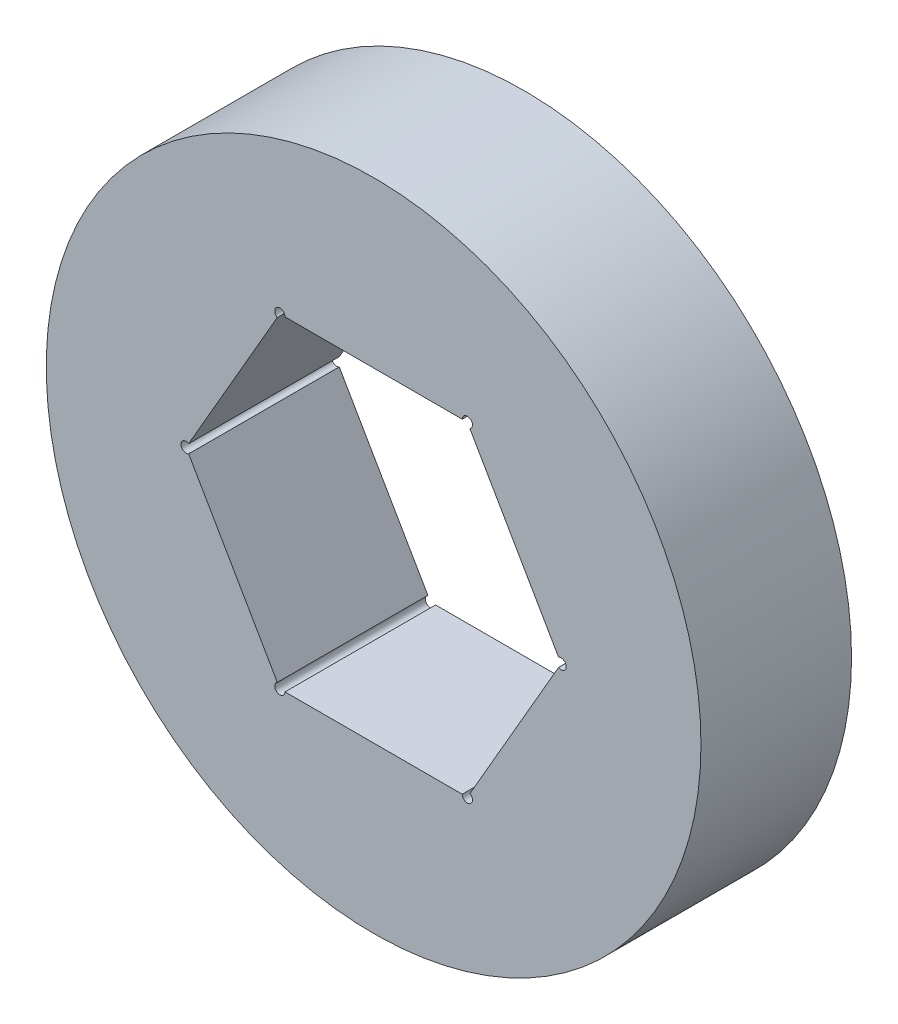
ISO-10303-21;
HEADER;
FILE_DESCRIPTION(('STEP AP214'),'2;1');
FILE_NAME('part.step','',(''),(''),'','','');
FILE_SCHEMA(('AUTOMOTIVE_DESIGN { 1 0 10303 214 1 1 1 1 }'));
ENDSEC;
DATA;
#1=APPLICATION_CONTEXT('core data for automotive mechanical design processes');
#2=APPLICATION_PROTOCOL_DEFINITION('international standard','automotive_design',2000,#1);
#3=PRODUCT_CONTEXT('',#1,'mechanical');
#4=PRODUCT('Part','Part','',(#3));
#5=PRODUCT_RELATED_PRODUCT_CATEGORY('part','',(#4));
#6=PRODUCT_DEFINITION_FORMATION('','',#4);
#7=PRODUCT_DEFINITION_CONTEXT('part definition',#1,'design');
#8=PRODUCT_DEFINITION('design','',#6,#7);
#9=PRODUCT_DEFINITION_SHAPE('','',#8);
#10=(LENGTH_UNIT() NAMED_UNIT(*) SI_UNIT(.MILLI.,.METRE.));
#11=(NAMED_UNIT(*) PLANE_ANGLE_UNIT() SI_UNIT($,.RADIAN.));
#12=(NAMED_UNIT(*) SI_UNIT($,.STERADIAN.) SOLID_ANGLE_UNIT());
#13=UNCERTAINTY_MEASURE_WITH_UNIT(LENGTH_MEASURE(1.E-05),#10,'distance_accuracy_value','');
#14=(GEOMETRIC_REPRESENTATION_CONTEXT(3) GLOBAL_UNCERTAINTY_ASSIGNED_CONTEXT((#13)) GLOBAL_UNIT_ASSIGNED_CONTEXT((#10,
#11,#12)) REPRESENTATION_CONTEXT('',''));
#15=CARTESIAN_POINT('',(0.,0.,0.));
#16=DIRECTION('',(0.,0.,1.));
#17=DIRECTION('',(1.,0.,0.));
#18=AXIS2_PLACEMENT_3D('',#15,#16,#17);
#19=CARTESIAN_POINT('',(0.,0.,5.842));
#20=DIRECTION('',(0.,0.,1.));
#21=DIRECTION('',(1.,0.,0.));
#22=AXIS2_PLACEMENT_3D('',#19,#20,#21);
#23=PLANE('',#22);
#24=CARTESIAN_POINT('',(7.27461339178928,0.,5.842));
#25=DIRECTION('',(0.,0.,1.));
#26=DIRECTION('',(1.,0.,0.));
#27=AXIS2_PLACEMENT_3D('',#24,#25,#26);
#28=CIRCLE('',#27,0.1984375);
#29=CARTESIAN_POINT('',(7.17539464178928,-0.171851916063474,5.842));
#30=VERTEX_POINT('',#29);
#31=CARTESIAN_POINT('',(7.17539464178928,0.171851916063475,5.842));
#32=VERTEX_POINT('',#31);
#33=EDGE_CURVE('E49',#30,#32,#28,.T.);
#34=ORIENTED_EDGE('',*,*,#33,.F.);
#35=DIRECTION('',(0.5,0.866025403784439,0.));
#36=VECTOR('',#35,1.);
#37=CARTESIAN_POINT('',(3.63730669589464,-6.3,5.842));
#38=LINE('',#37,#36);
#39=CARTESIAN_POINT('',(3.73652544589464,-6.12814808393653,5.842));
#40=VERTEX_POINT('',#39);
#41=EDGE_CURVE('E134',#40,#30,#38,.T.);
#42=ORIENTED_EDGE('',*,*,#41,.F.);
#43=CARTESIAN_POINT('',(3.63730669589464,-6.3,5.842));
#44=DIRECTION('',(0.,0.,1.));
#45=DIRECTION('',(1.,0.,0.));
#46=AXIS2_PLACEMENT_3D('',#43,#44,#45);
#47=CIRCLE('',#46,0.1984375);
#48=CARTESIAN_POINT('',(3.43886919589464,-6.3,5.842));
#49=VERTEX_POINT('',#48);
#50=EDGE_CURVE('E57',#49,#40,#47,.T.);
#51=ORIENTED_EDGE('',*,*,#50,.F.);
#52=DIRECTION('',(1.,0.,0.));
#53=VECTOR('',#52,1.);
#54=CARTESIAN_POINT('',(-3.63730669589464,-6.3,5.842));
#55=LINE('',#54,#53);
#56=CARTESIAN_POINT('',(-3.43886919589464,-6.3,5.842));
#57=VERTEX_POINT('',#56);
#58=EDGE_CURVE('E139',#57,#49,#55,.T.);
#59=ORIENTED_EDGE('',*,*,#58,.F.);
#60=CARTESIAN_POINT('',(-3.63730669589464,-6.3,5.842));
#61=DIRECTION('',(0.,0.,1.));
#62=DIRECTION('',(1.,0.,0.));
#63=AXIS2_PLACEMENT_3D('',#60,#61,#62);
#64=CIRCLE('',#63,0.1984375);
#65=CARTESIAN_POINT('',(-3.73652544589464,-6.12814808393653,5.842));
#66=VERTEX_POINT('',#65);
#67=EDGE_CURVE('E191',#66,#57,#64,.T.);
#68=ORIENTED_EDGE('',*,*,#67,.F.);
#69=DIRECTION('',(0.5,-0.866025403784439,0.));
#70=VECTOR('',#69,1.);
#71=CARTESIAN_POINT('',(-7.27461339178929,0.,5.842));
#72=LINE('',#71,#70);
#73=CARTESIAN_POINT('',(-7.17539464178928,-0.171851916063477,5.842));
#74=VERTEX_POINT('',#73);
#75=EDGE_CURVE('E144',#74,#66,#72,.T.);
#76=ORIENTED_EDGE('',*,*,#75,.F.);
#77=CARTESIAN_POINT('',(-7.27461339178929,0.,5.842));
#78=DIRECTION('',(0.,0.,1.));
#79=DIRECTION('',(1.,0.,0.));
#80=AXIS2_PLACEMENT_3D('',#77,#78,#79);
#81=CIRCLE('',#80,0.1984375);
#82=CARTESIAN_POINT('',(-7.17539464178929,0.171851916063472,5.842));
#83=VERTEX_POINT('',#82);
#84=EDGE_CURVE('E200',#83,#74,#81,.T.);
#85=ORIENTED_EDGE('',*,*,#84,.F.);
#86=DIRECTION('',(-0.5,-0.866025403784439,0.));
#87=VECTOR('',#86,1.);
#88=CARTESIAN_POINT('',(-3.63730669589464,6.3,5.842));
#89=LINE('',#88,#87);
#90=CARTESIAN_POINT('',(-3.73652544589464,6.12814808393653,5.842));
#91=VERTEX_POINT('',#90);
#92=EDGE_CURVE('E168',#91,#83,#89,.T.);
#93=ORIENTED_EDGE('',*,*,#92,.F.);
#94=CARTESIAN_POINT('',(-3.63730669589464,6.3,5.842));
#95=DIRECTION('',(0.,0.,1.));
#96=DIRECTION('',(1.,0.,0.));
#97=AXIS2_PLACEMENT_3D('',#94,#95,#96);
#98=CIRCLE('',#97,0.1984375);
#99=CARTESIAN_POINT('',(-3.43886919589464,6.3,5.842));
#100=VERTEX_POINT('',#99);
#101=EDGE_CURVE('E207',#100,#91,#98,.T.);
#102=ORIENTED_EDGE('',*,*,#101,.F.);
#103=DIRECTION('',(-1.,0.,0.));
#104=VECTOR('',#103,1.);
#105=CARTESIAN_POINT('',(3.63730669589464,6.3,5.842));
#106=LINE('',#105,#104);
#107=CARTESIAN_POINT('',(3.43886919589464,6.3,5.842));
#108=VERTEX_POINT('',#107);
#109=EDGE_CURVE('E141',#108,#100,#106,.T.);
#110=ORIENTED_EDGE('',*,*,#109,.F.);
#111=CARTESIAN_POINT('',(3.63730669589464,6.3,5.842));
#112=DIRECTION('',(0.,0.,1.));
#113=DIRECTION('',(1.,0.,0.));
#114=AXIS2_PLACEMENT_3D('',#111,#112,#113);
#115=CIRCLE('',#114,0.1984375);
#116=CARTESIAN_POINT('',(3.73652544589464,6.12814808393653,5.842));
#117=VERTEX_POINT('',#116);
#118=EDGE_CURVE('E214',#117,#108,#115,.T.);
#119=ORIENTED_EDGE('',*,*,#118,.F.);
#120=DIRECTION('',(-0.5,0.866025403784439,0.));
#121=VECTOR('',#120,1.);
#122=CARTESIAN_POINT('',(7.27461339178928,0.,5.842));
#123=LINE('',#122,#121);
#124=EDGE_CURVE('E136',#32,#117,#123,.T.);
#125=ORIENTED_EDGE('',*,*,#124,.F.);
#126=EDGE_LOOP('',(#34,#42,#51,#59,#68,#76,#85,#93,#102,#110,#119,#125));
#127=FACE_BOUND('',#126,.T.);
#128=CARTESIAN_POINT('',(0.,0.,5.842));
#129=DIRECTION('',(0.,0.,1.));
#130=DIRECTION('',(1.,0.,0.));
#131=AXIS2_PLACEMENT_3D('',#128,#129,#130);
#132=CIRCLE('',#131,12.7);
#133=CARTESIAN_POINT('',(12.7,0.,5.842));
#134=VERTEX_POINT('',#133);
#135=EDGE_CURVE('E169',#134,#134,#132,.T.);
#136=ORIENTED_EDGE('',*,*,#135,.T.);
#137=EDGE_LOOP('',(#136));
#138=FACE_BOUND('',#137,.T.);
#139=ADVANCED_FACE('F35',(#127,#138),#23,.T.);
#140=CARTESIAN_POINT('',(0.,0.,0.));
#141=DIRECTION('',(0.,0.,1.));
#142=DIRECTION('',(1.,0.,0.));
#143=AXIS2_PLACEMENT_3D('',#140,#141,#142);
#144=PLANE('',#143);
#145=CARTESIAN_POINT('',(0.,0.,0.));
#146=DIRECTION('',(0.,0.,1.));
#147=DIRECTION('',(1.,0.,0.));
#148=AXIS2_PLACEMENT_3D('',#145,#146,#147);
#149=CIRCLE('',#148,12.7);
#150=CARTESIAN_POINT('',(12.7,0.,0.));
#151=VERTEX_POINT('',#150);
#152=EDGE_CURVE('E150',#151,#151,#149,.T.);
#153=ORIENTED_EDGE('',*,*,#152,.F.);
#154=EDGE_LOOP('',(#153));
#155=FACE_BOUND('',#154,.T.);
#156=DIRECTION('',(0.5,0.866025403784439,0.));
#157=VECTOR('',#156,1.);
#158=CARTESIAN_POINT('',(3.63730669589464,-6.3,0.));
#159=LINE('',#158,#157);
#160=CARTESIAN_POINT('',(3.73652544589464,-6.12814808393653,0.));
#161=VERTEX_POINT('',#160);
#162=CARTESIAN_POINT('',(7.17539464178928,-0.171851916063474,0.));
#163=VERTEX_POINT('',#162);
#164=EDGE_CURVE('E161',#161,#163,#159,.T.);
#165=ORIENTED_EDGE('',*,*,#164,.T.);
#166=CARTESIAN_POINT('',(7.27461339178928,0.,0.));
#167=DIRECTION('',(0.,0.,1.));
#168=DIRECTION('',(1.,0.,0.));
#169=AXIS2_PLACEMENT_3D('',#166,#167,#168);
#170=CIRCLE('',#169,0.1984375);
#171=CARTESIAN_POINT('',(7.17539464178928,0.171851916063475,0.));
#172=VERTEX_POINT('',#171);
#173=EDGE_CURVE('E124',#163,#172,#170,.T.);
#174=ORIENTED_EDGE('',*,*,#173,.T.);
#175=DIRECTION('',(-0.5,0.866025403784439,0.));
#176=VECTOR('',#175,1.);
#177=CARTESIAN_POINT('',(7.27461339178928,0.,0.));
#178=LINE('',#177,#176);
#179=CARTESIAN_POINT('',(3.73652544589464,6.12814808393653,0.));
#180=VERTEX_POINT('',#179);
#181=EDGE_CURVE('E163',#172,#180,#178,.T.);
#182=ORIENTED_EDGE('',*,*,#181,.T.);
#183=CARTESIAN_POINT('',(3.63730669589464,6.3,0.));
#184=DIRECTION('',(0.,0.,1.));
#185=DIRECTION('',(1.,0.,0.));
#186=AXIS2_PLACEMENT_3D('',#183,#184,#185);
#187=CIRCLE('',#186,0.1984375);
#188=CARTESIAN_POINT('',(3.43886919589464,6.3,0.));
#189=VERTEX_POINT('',#188);
#190=EDGE_CURVE('E215',#180,#189,#187,.T.);
#191=ORIENTED_EDGE('',*,*,#190,.T.);
#192=DIRECTION('',(-1.,0.,0.));
#193=VECTOR('',#192,1.);
#194=CARTESIAN_POINT('',(3.63730669589464,6.3,0.));
#195=LINE('',#194,#193);
#196=CARTESIAN_POINT('',(-3.43886919589464,6.3,0.));
#197=VERTEX_POINT('',#196);
#198=EDGE_CURVE('E165',#189,#197,#195,.T.);
#199=ORIENTED_EDGE('',*,*,#198,.T.);
#200=CARTESIAN_POINT('',(-3.63730669589464,6.3,0.));
#201=DIRECTION('',(0.,0.,1.));
#202=DIRECTION('',(1.,0.,0.));
#203=AXIS2_PLACEMENT_3D('',#200,#201,#202);
#204=CIRCLE('',#203,0.1984375);
#205=CARTESIAN_POINT('',(-3.73652544589464,6.12814808393653,0.));
#206=VERTEX_POINT('',#205);
#207=EDGE_CURVE('E208',#197,#206,#204,.T.);
#208=ORIENTED_EDGE('',*,*,#207,.T.);
#209=DIRECTION('',(-0.5,-0.866025403784439,0.));
#210=VECTOR('',#209,1.);
#211=CARTESIAN_POINT('',(-3.63730669589464,6.3,0.));
#212=LINE('',#211,#210);
#213=CARTESIAN_POINT('',(-7.17539464178929,0.171851916063472,0.));
#214=VERTEX_POINT('',#213);
#215=EDGE_CURVE('E151',#206,#214,#212,.T.);
#216=ORIENTED_EDGE('',*,*,#215,.T.);
#217=CARTESIAN_POINT('',(-7.27461339178929,0.,0.));
#218=DIRECTION('',(0.,0.,1.));
#219=DIRECTION('',(1.,0.,0.));
#220=AXIS2_PLACEMENT_3D('',#217,#218,#219);
#221=CIRCLE('',#220,0.1984375);
#222=CARTESIAN_POINT('',(-7.17539464178928,-0.171851916063477,0.));
#223=VERTEX_POINT('',#222);
#224=EDGE_CURVE('E201',#214,#223,#221,.T.);
#225=ORIENTED_EDGE('',*,*,#224,.T.);
#226=DIRECTION('',(0.5,-0.866025403784439,0.));
#227=VECTOR('',#226,1.);
#228=CARTESIAN_POINT('',(-7.27461339178929,0.,0.));
#229=LINE('',#228,#227);
#230=CARTESIAN_POINT('',(-3.73652544589464,-6.12814808393653,0.));
#231=VERTEX_POINT('',#230);
#232=EDGE_CURVE('E154',#223,#231,#229,.T.);
#233=ORIENTED_EDGE('',*,*,#232,.T.);
#234=CARTESIAN_POINT('',(-3.63730669589464,-6.3,0.));
#235=DIRECTION('',(0.,0.,1.));
#236=DIRECTION('',(1.,0.,0.));
#237=AXIS2_PLACEMENT_3D('',#234,#235,#236);
#238=CIRCLE('',#237,0.1984375);
#239=CARTESIAN_POINT('',(-3.43886919589464,-6.3,0.));
#240=VERTEX_POINT('',#239);
#241=EDGE_CURVE('E195',#231,#240,#238,.T.);
#242=ORIENTED_EDGE('',*,*,#241,.T.);
#243=DIRECTION('',(1.,0.,0.));
#244=VECTOR('',#243,1.);
#245=CARTESIAN_POINT('',(-3.63730669589464,-6.3,0.));
#246=LINE('',#245,#244);
#247=CARTESIAN_POINT('',(3.43886919589464,-6.3,0.));
#248=VERTEX_POINT('',#247);
#249=EDGE_CURVE('E158',#240,#248,#246,.T.);
#250=ORIENTED_EDGE('',*,*,#249,.T.);
#251=CARTESIAN_POINT('',(3.63730669589464,-6.3,0.));
#252=DIRECTION('',(0.,0.,1.));
#253=DIRECTION('',(1.,0.,0.));
#254=AXIS2_PLACEMENT_3D('',#251,#252,#253);
#255=CIRCLE('',#254,0.1984375);
#256=EDGE_CURVE('E183',#248,#161,#255,.T.);
#257=ORIENTED_EDGE('',*,*,#256,.T.);
#258=EDGE_LOOP('',(#165,#174,#182,#191,#199,#208,#216,#225,#233,#242,#250,#257));
#259=FACE_BOUND('',#258,.T.);
#260=ADVANCED_FACE('F186',(#155,#259),#144,.F.);
#261=CARTESIAN_POINT('',(0.,0.,5.842));
#262=DIRECTION('',(0.,0.,-1.));
#263=DIRECTION('',(-1.,0.,0.));
#264=AXIS2_PLACEMENT_3D('',#261,#262,#263);
#265=CYLINDRICAL_SURFACE('',#264,12.7);
#266=ORIENTED_EDGE('',*,*,#135,.F.);
#267=EDGE_LOOP('',(#266));
#268=FACE_BOUND('',#267,.T.);
#269=ORIENTED_EDGE('',*,*,#152,.T.);
#270=EDGE_LOOP('',(#269));
#271=FACE_BOUND('',#270,.T.);
#272=ADVANCED_FACE('F37',(#268,#271),#265,.T.);
#273=CARTESIAN_POINT('',(-3.63730669589464,6.3,5.842));
#274=DIRECTION('',(0.866025403784439,-0.5,0.));
#275=DIRECTION('',(0.5,0.866025403784439,0.));
#276=AXIS2_PLACEMENT_3D('',#273,#274,#275);
#277=PLANE('',#276);
#278=DIRECTION('',(0.,0.,1.));
#279=VECTOR('',#278,1.);
#280=CARTESIAN_POINT('',(-7.17539464178929,0.171851916063472,0.));
#281=LINE('',#280,#279);
#282=EDGE_CURVE('E204',#214,#83,#281,.T.);
#283=ORIENTED_EDGE('',*,*,#282,.F.);
#284=ORIENTED_EDGE('',*,*,#215,.F.);
#285=DIRECTION('',(0.,0.,1.));
#286=VECTOR('',#285,1.);
#287=CARTESIAN_POINT('',(-3.73652544589464,6.12814808393653,0.));
#288=LINE('',#287,#286);
#289=EDGE_CURVE('E211',#91,#206,#288,.F.);
#290=ORIENTED_EDGE('',*,*,#289,.F.);
#291=ORIENTED_EDGE('',*,*,#92,.T.);
#292=EDGE_LOOP('',(#283,#284,#290,#291));
#293=FACE_BOUND('',#292,.T.);
#294=ADVANCED_FACE('F246',(#293),#277,.T.);
#295=CARTESIAN_POINT('',(-7.27461339178929,0.,5.842));
#296=DIRECTION('',(0.866025403784439,0.5,0.));
#297=DIRECTION('',(-0.5,0.866025403784439,0.));
#298=AXIS2_PLACEMENT_3D('',#295,#296,#297);
#299=PLANE('',#298);
#300=DIRECTION('',(0.,0.,1.));
#301=VECTOR('',#300,1.);
#302=CARTESIAN_POINT('',(-3.73652544589464,-6.12814808393653,0.));
#303=LINE('',#302,#301);
#304=EDGE_CURVE('E197',#231,#66,#303,.T.);
#305=ORIENTED_EDGE('',*,*,#304,.F.);
#306=ORIENTED_EDGE('',*,*,#232,.F.);
#307=DIRECTION('',(0.,0.,1.));
#308=VECTOR('',#307,1.);
#309=CARTESIAN_POINT('',(-7.17539464178928,-0.171851916063477,0.));
#310=LINE('',#309,#308);
#311=EDGE_CURVE('E178',#74,#223,#310,.F.);
#312=ORIENTED_EDGE('',*,*,#311,.F.);
#313=ORIENTED_EDGE('',*,*,#75,.T.);
#314=EDGE_LOOP('',(#305,#306,#312,#313));
#315=FACE_BOUND('',#314,.T.);
#316=ADVANCED_FACE('F227',(#315),#299,.T.);
#317=CARTESIAN_POINT('',(-3.63730669589464,-6.3,5.842));
#318=DIRECTION('',(0.,1.,0.));
#319=DIRECTION('',(0.,0.,1.));
#320=AXIS2_PLACEMENT_3D('',#317,#318,#319);
#321=PLANE('',#320);
#322=DIRECTION('',(0.,0.,1.));
#323=VECTOR('',#322,1.);
#324=CARTESIAN_POINT('',(3.43886919589464,-6.3,0.));
#325=LINE('',#324,#323);
#326=EDGE_CURVE('E189',#248,#49,#325,.T.);
#327=ORIENTED_EDGE('',*,*,#326,.F.);
#328=ORIENTED_EDGE('',*,*,#249,.F.);
#329=DIRECTION('',(0.,0.,1.));
#330=VECTOR('',#329,1.);
#331=CARTESIAN_POINT('',(-3.43886919589464,-6.3,0.));
#332=LINE('',#331,#330);
#333=EDGE_CURVE('E180',#57,#240,#332,.F.);
#334=ORIENTED_EDGE('',*,*,#333,.F.);
#335=ORIENTED_EDGE('',*,*,#58,.T.);
#336=EDGE_LOOP('',(#327,#328,#334,#335));
#337=FACE_BOUND('',#336,.T.);
#338=ADVANCED_FACE('F237',(#337),#321,.T.);
#339=CARTESIAN_POINT('',(3.63730669589464,-6.3,5.842));
#340=DIRECTION('',(-0.866025403784439,0.5,0.));
#341=DIRECTION('',(-0.5,-0.866025403784439,0.));
#342=AXIS2_PLACEMENT_3D('',#339,#340,#341);
#343=PLANE('',#342);
#344=DIRECTION('',(0.,0.,1.));
#345=VECTOR('',#344,1.);
#346=CARTESIAN_POINT('',(7.17539464178928,-0.171851916063474,0.));
#347=LINE('',#346,#345);
#348=EDGE_CURVE('E121',#163,#30,#347,.T.);
#349=ORIENTED_EDGE('',*,*,#348,.F.);
#350=ORIENTED_EDGE('',*,*,#164,.F.);
#351=DIRECTION('',(0.,0.,1.));
#352=VECTOR('',#351,1.);
#353=CARTESIAN_POINT('',(3.73652544589464,-6.12814808393653,0.));
#354=LINE('',#353,#352);
#355=EDGE_CURVE('E43',#40,#161,#354,.F.);
#356=ORIENTED_EDGE('',*,*,#355,.F.);
#357=ORIENTED_EDGE('',*,*,#41,.T.);
#358=EDGE_LOOP('',(#349,#350,#356,#357));
#359=FACE_BOUND('',#358,.T.);
#360=ADVANCED_FACE('F138',(#359),#343,.T.);
#361=CARTESIAN_POINT('',(7.27461339178928,0.,5.842));
#362=DIRECTION('',(-0.866025403784439,-0.5,0.));
#363=DIRECTION('',(0.5,-0.866025403784439,0.));
#364=AXIS2_PLACEMENT_3D('',#361,#362,#363);
#365=PLANE('',#364);
#366=DIRECTION('',(0.,0.,1.));
#367=VECTOR('',#366,1.);
#368=CARTESIAN_POINT('',(7.17539464178928,0.171851916063475,0.));
#369=LINE('',#368,#367);
#370=EDGE_CURVE('E11',#32,#172,#369,.F.);
#371=ORIENTED_EDGE('',*,*,#370,.F.);
#372=ORIENTED_EDGE('',*,*,#124,.T.);
#373=DIRECTION('',(0.,0.,1.));
#374=VECTOR('',#373,1.);
#375=CARTESIAN_POINT('',(3.73652544589464,6.12814808393653,0.));
#376=LINE('',#375,#374);
#377=EDGE_CURVE('E155',#180,#117,#376,.T.);
#378=ORIENTED_EDGE('',*,*,#377,.F.);
#379=ORIENTED_EDGE('',*,*,#181,.F.);
#380=EDGE_LOOP('',(#371,#372,#378,#379));
#381=FACE_BOUND('',#380,.T.);
#382=ADVANCED_FACE('F244',(#381),#365,.T.);
#383=CARTESIAN_POINT('',(3.63730669589464,6.3,5.842));
#384=DIRECTION('',(0.,-1.,0.));
#385=DIRECTION('',(1.,0.,0.));
#386=AXIS2_PLACEMENT_3D('',#383,#384,#385);
#387=PLANE('',#386);
#388=DIRECTION('',(0.,0.,1.));
#389=VECTOR('',#388,1.);
#390=CARTESIAN_POINT('',(-3.43886919589464,6.3,0.));
#391=LINE('',#390,#389);
#392=EDGE_CURVE('E176',#197,#100,#391,.T.);
#393=ORIENTED_EDGE('',*,*,#392,.F.);
#394=ORIENTED_EDGE('',*,*,#198,.F.);
#395=DIRECTION('',(0.,0.,1.));
#396=VECTOR('',#395,1.);
#397=CARTESIAN_POINT('',(3.43886919589464,6.3,0.));
#398=LINE('',#397,#396);
#399=EDGE_CURVE('E172',#108,#189,#398,.F.);
#400=ORIENTED_EDGE('',*,*,#399,.F.);
#401=ORIENTED_EDGE('',*,*,#109,.T.);
#402=EDGE_LOOP('',(#393,#394,#400,#401));
#403=FACE_BOUND('',#402,.T.);
#404=ADVANCED_FACE('F271',(#403),#387,.T.);
#405=CARTESIAN_POINT('',(3.63730669589464,6.3,0.));
#406=DIRECTION('',(0.,0.,1.));
#407=DIRECTION('',(1.,0.,0.));
#408=AXIS2_PLACEMENT_3D('',#405,#406,#407);
#409=CYLINDRICAL_SURFACE('',#408,0.1984375);
#410=ORIENTED_EDGE('',*,*,#377,.T.);
#411=ORIENTED_EDGE('',*,*,#118,.T.);
#412=ORIENTED_EDGE('',*,*,#399,.T.);
#413=ORIENTED_EDGE('',*,*,#190,.F.);
#414=EDGE_LOOP('',(#410,#411,#412,#413));
#415=FACE_BOUND('',#414,.T.);
#416=ADVANCED_FACE('F275',(#415),#409,.F.);
#417=CARTESIAN_POINT('',(-3.63730669589464,6.3,0.));
#418=DIRECTION('',(0.,0.,1.));
#419=DIRECTION('',(1.,0.,0.));
#420=AXIS2_PLACEMENT_3D('',#417,#418,#419);
#421=CYLINDRICAL_SURFACE('',#420,0.1984375);
#422=ORIENTED_EDGE('',*,*,#289,.T.);
#423=ORIENTED_EDGE('',*,*,#207,.F.);
#424=ORIENTED_EDGE('',*,*,#392,.T.);
#425=ORIENTED_EDGE('',*,*,#101,.T.);
#426=EDGE_LOOP('',(#422,#423,#424,#425));
#427=FACE_BOUND('',#426,.T.);
#428=ADVANCED_FACE('F268',(#427),#421,.F.);
#429=CARTESIAN_POINT('',(-7.27461339178929,0.,0.));
#430=DIRECTION('',(0.,0.,1.));
#431=DIRECTION('',(1.,0.,0.));
#432=AXIS2_PLACEMENT_3D('',#429,#430,#431);
#433=CYLINDRICAL_SURFACE('',#432,0.1984375);
#434=ORIENTED_EDGE('',*,*,#282,.T.);
#435=ORIENTED_EDGE('',*,*,#84,.T.);
#436=ORIENTED_EDGE('',*,*,#311,.T.);
#437=ORIENTED_EDGE('',*,*,#224,.F.);
#438=EDGE_LOOP('',(#434,#435,#436,#437));
#439=FACE_BOUND('',#438,.T.);
#440=ADVANCED_FACE('F292',(#439),#433,.F.);
#441=CARTESIAN_POINT('',(-3.63730669589464,-6.3,0.));
#442=DIRECTION('',(0.,0.,1.));
#443=DIRECTION('',(1.,0.,0.));
#444=AXIS2_PLACEMENT_3D('',#441,#442,#443);
#445=CYLINDRICAL_SURFACE('',#444,0.1984375);
#446=ORIENTED_EDGE('',*,*,#304,.T.);
#447=ORIENTED_EDGE('',*,*,#67,.T.);
#448=ORIENTED_EDGE('',*,*,#333,.T.);
#449=ORIENTED_EDGE('',*,*,#241,.F.);
#450=EDGE_LOOP('',(#446,#447,#448,#449));
#451=FACE_BOUND('',#450,.T.);
#452=ADVANCED_FACE('F235',(#451),#445,.F.);
#453=CARTESIAN_POINT('',(3.63730669589464,-6.3,0.));
#454=DIRECTION('',(0.,0.,1.));
#455=DIRECTION('',(1.,0.,0.));
#456=AXIS2_PLACEMENT_3D('',#453,#454,#455);
#457=CYLINDRICAL_SURFACE('',#456,0.1984375);
#458=ORIENTED_EDGE('',*,*,#326,.T.);
#459=ORIENTED_EDGE('',*,*,#50,.T.);
#460=ORIENTED_EDGE('',*,*,#355,.T.);
#461=ORIENTED_EDGE('',*,*,#256,.F.);
#462=EDGE_LOOP('',(#458,#459,#460,#461));
#463=FACE_BOUND('',#462,.T.);
#464=ADVANCED_FACE('F182',(#463),#457,.F.);
#465=CARTESIAN_POINT('',(7.27461339178928,0.,0.));
#466=DIRECTION('',(0.,0.,1.));
#467=DIRECTION('',(1.,0.,0.));
#468=AXIS2_PLACEMENT_3D('',#465,#466,#467);
#469=CYLINDRICAL_SURFACE('',#468,0.1984375);
#470=ORIENTED_EDGE('',*,*,#348,.T.);
#471=ORIENTED_EDGE('',*,*,#33,.T.);
#472=ORIENTED_EDGE('',*,*,#370,.T.);
#473=ORIENTED_EDGE('',*,*,#173,.F.);
#474=EDGE_LOOP('',(#470,#471,#472,#473));
#475=FACE_BOUND('',#474,.T.);
#476=ADVANCED_FACE('F122',(#475),#469,.F.);
#477=CLOSED_SHELL('',(#139,#260,#272,#294,#316,#338,#360,#382,#404,#416,#428,#440,#452,#464,#476));
#478=MANIFOLD_SOLID_BREP('B2',#477);
#479=ADVANCED_BREP_SHAPE_REPRESENTATION('',(#18,#478),#14);
#480=SHAPE_DEFINITION_REPRESENTATION(#9,#479);
ENDSEC;
END-ISO-10303-21;
